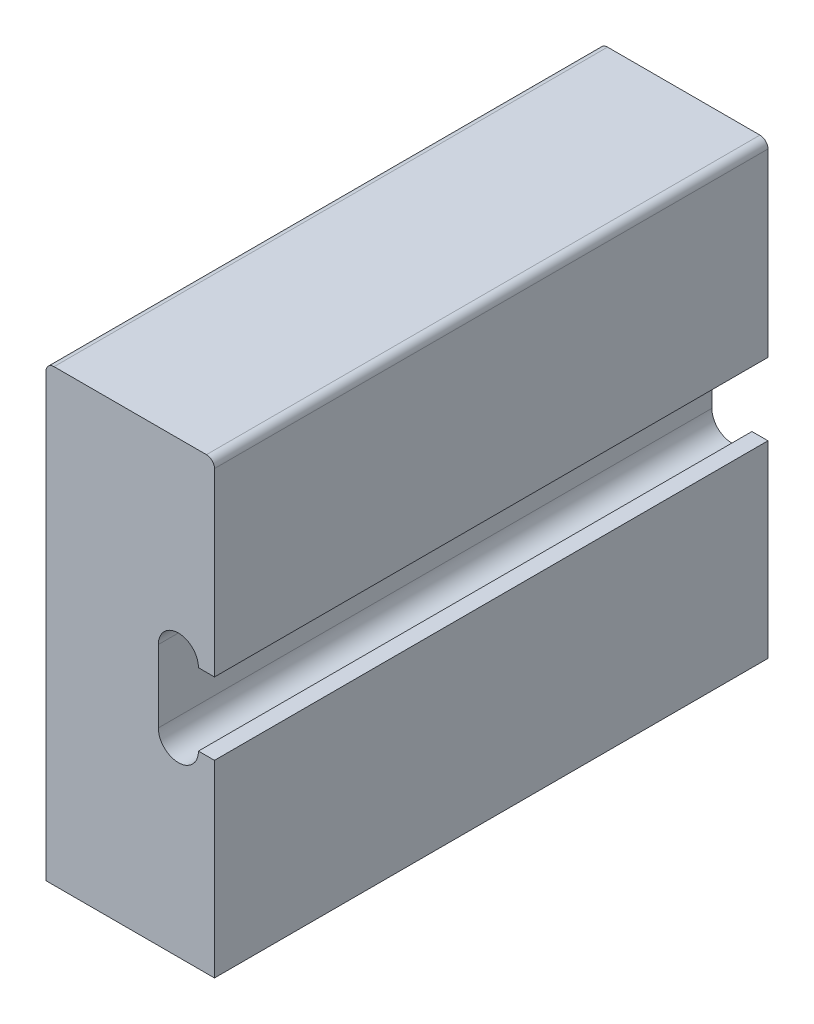
ISO-10303-21;
HEADER;
FILE_DESCRIPTION(('STEP AP214'),'2;1');
FILE_NAME('part.step','',(''),(''),'','','');
FILE_SCHEMA(('AUTOMOTIVE_DESIGN { 1 0 10303 214 1 1 1 1 }'));
ENDSEC;
DATA;
#1=APPLICATION_CONTEXT('core data for automotive mechanical design processes');
#2=APPLICATION_PROTOCOL_DEFINITION('international standard','automotive_design',2000,#1);
#3=PRODUCT_CONTEXT('',#1,'mechanical');
#4=PRODUCT('Part','Part','',(#3));
#5=PRODUCT_RELATED_PRODUCT_CATEGORY('part','',(#4));
#6=PRODUCT_DEFINITION_FORMATION('','',#4);
#7=PRODUCT_DEFINITION_CONTEXT('part definition',#1,'design');
#8=PRODUCT_DEFINITION('design','',#6,#7);
#9=PRODUCT_DEFINITION_SHAPE('','',#8);
#10=(LENGTH_UNIT() NAMED_UNIT(*) SI_UNIT(.MILLI.,.METRE.));
#11=(NAMED_UNIT(*) PLANE_ANGLE_UNIT() SI_UNIT($,.RADIAN.));
#12=(NAMED_UNIT(*) SI_UNIT($,.STERADIAN.) SOLID_ANGLE_UNIT());
#13=UNCERTAINTY_MEASURE_WITH_UNIT(LENGTH_MEASURE(1.E-05),#10,'distance_accuracy_value','');
#14=(GEOMETRIC_REPRESENTATION_CONTEXT(3) GLOBAL_UNCERTAINTY_ASSIGNED_CONTEXT((#13)) GLOBAL_UNIT_ASSIGNED_CONTEXT((#10,
#11,#12)) REPRESENTATION_CONTEXT('',''));
#15=CARTESIAN_POINT('',(0.,0.,0.));
#16=DIRECTION('',(0.,0.,1.));
#17=DIRECTION('',(1.,0.,0.));
#18=AXIS2_PLACEMENT_3D('',#15,#16,#17);
#19=CARTESIAN_POINT('',(21.,0.,0.));
#20=DIRECTION('',(-1.,0.,0.));
#21=DIRECTION('',(0.,0.,1.));
#22=AXIS2_PLACEMENT_3D('',#19,#20,#21);
#23=PLANE('',#22);
#24=DIRECTION('',(0.,-1.,0.));
#25=VECTOR('',#24,1.);
#26=CARTESIAN_POINT('',(21.,-28.,34.5));
#27=LINE('',#26,#25);
#28=CARTESIAN_POINT('',(21.,27.,34.5));
#29=VERTEX_POINT('',#28);
#30=CARTESIAN_POINT('',(21.,4.49999999999999,34.5));
#31=VERTEX_POINT('',#30);
#32=EDGE_CURVE('E172',#29,#31,#27,.T.);
#33=ORIENTED_EDGE('',*,*,#32,.T.);
#34=DIRECTION('',(0.,0.,-1.));
#35=VECTOR('',#34,1.);
#36=CARTESIAN_POINT('',(21.,4.49999999999999,34.5));
#37=LINE('',#36,#35);
#38=CARTESIAN_POINT('',(21.,4.5,-34.5));
#39=VERTEX_POINT('',#38);
#40=EDGE_CURVE('E163',#31,#39,#37,.T.);
#41=ORIENTED_EDGE('',*,*,#40,.T.);
#42=DIRECTION('',(0.,1.,0.));
#43=VECTOR('',#42,1.);
#44=CARTESIAN_POINT('',(21.,28.,-34.5));
#45=LINE('',#44,#43);
#46=CARTESIAN_POINT('',(21.,27.,-34.5));
#47=VERTEX_POINT('',#46);
#48=EDGE_CURVE('E54',#39,#47,#45,.T.);
#49=ORIENTED_EDGE('',*,*,#48,.T.);
#50=DIRECTION('',(0.,0.,1.));
#51=VECTOR('',#50,1.);
#52=CARTESIAN_POINT('',(21.,27.,0.));
#53=LINE('',#52,#51);
#54=EDGE_CURVE('E11',#47,#29,#53,.T.);
#55=ORIENTED_EDGE('',*,*,#54,.T.);
#56=EDGE_LOOP('',(#33,#41,#49,#55));
#57=FACE_BOUND('',#56,.T.);
#58=ADVANCED_FACE('F32',(#57),#23,.F.);
#59=CARTESIAN_POINT('',(21.,-28.,-34.5));
#60=DIRECTION('',(0.,1.,0.));
#61=DIRECTION('',(0.,0.,1.));
#62=AXIS2_PLACEMENT_3D('',#59,#60,#61);
#63=PLANE('',#62);
#64=DIRECTION('',(0.,0.,-1.));
#65=VECTOR('',#64,1.);
#66=CARTESIAN_POINT('',(0.,-28.,-34.5));
#67=LINE('',#66,#65);
#68=CARTESIAN_POINT('',(0.,-28.,34.5));
#69=VERTEX_POINT('',#68);
#70=CARTESIAN_POINT('',(0.,-28.,-34.5));
#71=VERTEX_POINT('',#70);
#72=EDGE_CURVE('E165',#69,#71,#67,.T.);
#73=ORIENTED_EDGE('',*,*,#72,.T.);
#74=DIRECTION('',(-1.,0.,0.));
#75=VECTOR('',#74,1.);
#76=CARTESIAN_POINT('',(21.,-28.,-34.5));
#77=LINE('',#76,#75);
#78=CARTESIAN_POINT('',(21.,-28.,-34.5));
#79=VERTEX_POINT('',#78);
#80=EDGE_CURVE('E192',#79,#71,#77,.T.);
#81=ORIENTED_EDGE('',*,*,#80,.F.);
#82=DIRECTION('',(0.,0.,-1.));
#83=VECTOR('',#82,1.);
#84=CARTESIAN_POINT('',(21.,-28.,-34.5));
#85=LINE('',#84,#83);
#86=CARTESIAN_POINT('',(21.,-28.,34.5));
#87=VERTEX_POINT('',#86);
#88=EDGE_CURVE('E175',#87,#79,#85,.T.);
#89=ORIENTED_EDGE('',*,*,#88,.F.);
#90=DIRECTION('',(-1.,0.,0.));
#91=VECTOR('',#90,1.);
#92=CARTESIAN_POINT('',(21.,-28.,34.5));
#93=LINE('',#92,#91);
#94=EDGE_CURVE('E195',#87,#69,#93,.T.);
#95=ORIENTED_EDGE('',*,*,#94,.T.);
#96=EDGE_LOOP('',(#73,#81,#89,#95));
#97=FACE_BOUND('',#96,.T.);
#98=ADVANCED_FACE('F231',(#97),#63,.F.);
#99=CARTESIAN_POINT('',(21.,28.,-34.5));
#100=DIRECTION('',(0.,0.,1.));
#101=DIRECTION('',(0.,-1.,0.));
#102=AXIS2_PLACEMENT_3D('',#99,#100,#101);
#103=PLANE('',#102);
#104=ORIENTED_EDGE('',*,*,#48,.F.);
#105=DIRECTION('',(1.,0.,0.));
#106=VECTOR('',#105,1.);
#107=CARTESIAN_POINT('',(19.,4.5,-34.5));
#108=LINE('',#107,#106);
#109=CARTESIAN_POINT('',(19.,4.5,-34.5));
#110=VERTEX_POINT('',#109);
#111=EDGE_CURVE('E144',#110,#39,#108,.T.);
#112=ORIENTED_EDGE('',*,*,#111,.F.);
#113=CARTESIAN_POINT('',(16.5,4.5,-34.5));
#114=DIRECTION('',(0.,0.,-1.));
#115=DIRECTION('',(0.,1.,0.));
#116=AXIS2_PLACEMENT_3D('',#113,#114,#115);
#117=CIRCLE('',#116,2.5);
#118=CARTESIAN_POINT('',(14.,4.5,-34.5));
#119=VERTEX_POINT('',#118);
#120=EDGE_CURVE('E146',#119,#110,#117,.T.);
#121=ORIENTED_EDGE('',*,*,#120,.F.);
#122=DIRECTION('',(0.,1.,0.));
#123=VECTOR('',#122,1.);
#124=CARTESIAN_POINT('',(14.,-4.5,-34.5));
#125=LINE('',#124,#123);
#126=CARTESIAN_POINT('',(14.,-4.5,-34.5));
#127=VERTEX_POINT('',#126);
#128=EDGE_CURVE('E158',#127,#119,#125,.T.);
#129=ORIENTED_EDGE('',*,*,#128,.F.);
#130=CARTESIAN_POINT('',(16.5,-4.5,-34.5));
#131=DIRECTION('',(0.,0.,-1.));
#132=DIRECTION('',(0.,1.,0.));
#133=AXIS2_PLACEMENT_3D('',#130,#131,#132);
#134=CIRCLE('',#133,2.5);
#135=CARTESIAN_POINT('',(19.,-4.5,-34.5));
#136=VERTEX_POINT('',#135);
#137=EDGE_CURVE('E156',#136,#127,#134,.T.);
#138=ORIENTED_EDGE('',*,*,#137,.F.);
#139=DIRECTION('',(-1.,0.,0.));
#140=VECTOR('',#139,1.);
#141=CARTESIAN_POINT('',(21.,-4.5,-34.5));
#142=LINE('',#141,#140);
#143=CARTESIAN_POINT('',(21.,-4.5,-34.5));
#144=VERTEX_POINT('',#143);
#145=EDGE_CURVE('E124',#144,#136,#142,.T.);
#146=ORIENTED_EDGE('',*,*,#145,.F.);
#147=EDGE_CURVE('E177',#79,#144,#45,.T.);
#148=ORIENTED_EDGE('',*,*,#147,.F.);
#149=ORIENTED_EDGE('',*,*,#80,.T.);
#150=DIRECTION('',(0.,1.,0.));
#151=VECTOR('',#150,1.);
#152=CARTESIAN_POINT('',(0.,28.,-34.5));
#153=LINE('',#152,#151);
#154=CARTESIAN_POINT('',(0.,27.,-34.5));
#155=VERTEX_POINT('',#154);
#156=EDGE_CURVE('E182',#71,#155,#153,.T.);
#157=ORIENTED_EDGE('',*,*,#156,.T.);
#158=CARTESIAN_POINT('',(1.,27.,-34.5));
#159=DIRECTION('',(0.,0.,1.));
#160=DIRECTION('',(0.,-1.,0.));
#161=AXIS2_PLACEMENT_3D('',#158,#159,#160);
#162=CIRCLE('',#161,1.);
#163=CARTESIAN_POINT('',(1.00000000000001,28.,-34.5));
#164=VERTEX_POINT('',#163);
#165=EDGE_CURVE('E40',#155,#164,#162,.F.);
#166=ORIENTED_EDGE('',*,*,#165,.T.);
#167=DIRECTION('',(-1.,0.,0.));
#168=VECTOR('',#167,1.);
#169=CARTESIAN_POINT('',(21.,28.,-34.5));
#170=LINE('',#169,#168);
#171=CARTESIAN_POINT('',(20.,28.,-34.5));
#172=VERTEX_POINT('',#171);
#173=EDGE_CURVE('E189',#172,#164,#170,.T.);
#174=ORIENTED_EDGE('',*,*,#173,.F.);
#175=CARTESIAN_POINT('',(20.,27.,-34.5));
#176=DIRECTION('',(0.,0.,1.));
#177=DIRECTION('',(0.,-1.,0.));
#178=AXIS2_PLACEMENT_3D('',#175,#176,#177);
#179=CIRCLE('',#178,1.);
#180=EDGE_CURVE('E209',#172,#47,#179,.F.);
#181=ORIENTED_EDGE('',*,*,#180,.T.);
#182=EDGE_LOOP('',(#104,#112,#121,#129,#138,#146,#148,#149,#157,#166,#174,#181));
#183=FACE_BOUND('',#182,.T.);
#184=ADVANCED_FACE('F213',(#183),#103,.F.);
#185=CARTESIAN_POINT('',(21.,28.,34.5));
#186=DIRECTION('',(0.,-1.,0.));
#187=DIRECTION('',(0.,0.,-1.));
#188=AXIS2_PLACEMENT_3D('',#185,#186,#187);
#189=PLANE('',#188);
#190=ORIENTED_EDGE('',*,*,#173,.T.);
#191=DIRECTION('',(0.,0.,1.));
#192=VECTOR('',#191,1.);
#193=CARTESIAN_POINT('',(1.,28.,34.5));
#194=LINE('',#193,#192);
#195=CARTESIAN_POINT('',(1.00000000000001,28.,34.5));
#196=VERTEX_POINT('',#195);
#197=EDGE_CURVE('E200',#164,#196,#194,.T.);
#198=ORIENTED_EDGE('',*,*,#197,.T.);
#199=DIRECTION('',(-1.,0.,0.));
#200=VECTOR('',#199,1.);
#201=CARTESIAN_POINT('',(21.,28.,34.5));
#202=LINE('',#201,#200);
#203=CARTESIAN_POINT('',(20.,28.,34.5));
#204=VERTEX_POINT('',#203);
#205=EDGE_CURVE('E180',#204,#196,#202,.T.);
#206=ORIENTED_EDGE('',*,*,#205,.F.);
#207=DIRECTION('',(0.,0.,1.));
#208=VECTOR('',#207,1.);
#209=CARTESIAN_POINT('',(20.,28.,34.5));
#210=LINE('',#209,#208);
#211=EDGE_CURVE('E198',#204,#172,#210,.F.);
#212=ORIENTED_EDGE('',*,*,#211,.T.);
#213=EDGE_LOOP('',(#190,#198,#206,#212));
#214=FACE_BOUND('',#213,.T.);
#215=ADVANCED_FACE('F220',(#214),#189,.F.);
#216=CARTESIAN_POINT('',(21.,0.,34.5));
#217=DIRECTION('',(0.,0.,-1.));
#218=DIRECTION('',(-1.,0.,0.));
#219=AXIS2_PLACEMENT_3D('',#216,#217,#218);
#220=PLANE('',#219);
#221=CARTESIAN_POINT('',(16.5,4.49999999999999,34.5));
#222=DIRECTION('',(0.,0.,-1.));
#223=DIRECTION('',(0.,1.,0.));
#224=AXIS2_PLACEMENT_3D('',#221,#222,#223);
#225=CIRCLE('',#224,2.5);
#226=CARTESIAN_POINT('',(14.,4.49999999999999,34.5));
#227=VERTEX_POINT('',#226);
#228=CARTESIAN_POINT('',(19.,4.49999999999999,34.5));
#229=VERTEX_POINT('',#228);
#230=EDGE_CURVE('E150',#227,#229,#225,.T.);
#231=ORIENTED_EDGE('',*,*,#230,.T.);
#232=DIRECTION('',(1.,0.,0.));
#233=VECTOR('',#232,1.);
#234=CARTESIAN_POINT('',(19.,4.49999999999999,34.5));
#235=LINE('',#234,#233);
#236=EDGE_CURVE('E152',#229,#31,#235,.T.);
#237=ORIENTED_EDGE('',*,*,#236,.T.);
#238=ORIENTED_EDGE('',*,*,#32,.F.);
#239=CARTESIAN_POINT('',(20.,27.,34.5));
#240=DIRECTION('',(0.,0.,-1.));
#241=DIRECTION('',(-1.,0.,0.));
#242=AXIS2_PLACEMENT_3D('',#239,#240,#241);
#243=CIRCLE('',#242,1.);
#244=EDGE_CURVE('E203',#29,#204,#243,.F.);
#245=ORIENTED_EDGE('',*,*,#244,.T.);
#246=ORIENTED_EDGE('',*,*,#205,.T.);
#247=CARTESIAN_POINT('',(1.,27.,34.5));
#248=DIRECTION('',(0.,0.,-1.));
#249=DIRECTION('',(-1.,0.,0.));
#250=AXIS2_PLACEMENT_3D('',#247,#248,#249);
#251=CIRCLE('',#250,1.);
#252=CARTESIAN_POINT('',(0.,27.,34.5));
#253=VERTEX_POINT('',#252);
#254=EDGE_CURVE('E205',#196,#253,#251,.F.);
#255=ORIENTED_EDGE('',*,*,#254,.T.);
#256=DIRECTION('',(0.,-1.,0.));
#257=VECTOR('',#256,1.);
#258=CARTESIAN_POINT('',(0.,0.,34.5));
#259=LINE('',#258,#257);
#260=EDGE_CURVE('E185',#253,#69,#259,.T.);
#261=ORIENTED_EDGE('',*,*,#260,.T.);
#262=ORIENTED_EDGE('',*,*,#94,.F.);
#263=CARTESIAN_POINT('',(21.,-4.50000000000001,34.5));
#264=VERTEX_POINT('',#263);
#265=EDGE_CURVE('E143',#264,#87,#27,.T.);
#266=ORIENTED_EDGE('',*,*,#265,.F.);
#267=DIRECTION('',(-1.,0.,0.));
#268=VECTOR('',#267,1.);
#269=CARTESIAN_POINT('',(21.,-4.50000000000001,34.5));
#270=LINE('',#269,#268);
#271=CARTESIAN_POINT('',(19.,-4.50000000000001,34.5));
#272=VERTEX_POINT('',#271);
#273=EDGE_CURVE('E47',#264,#272,#270,.T.);
#274=ORIENTED_EDGE('',*,*,#273,.T.);
#275=CARTESIAN_POINT('',(16.5,-4.50000000000001,34.5));
#276=DIRECTION('',(0.,0.,-1.));
#277=DIRECTION('',(0.,1.,0.));
#278=AXIS2_PLACEMENT_3D('',#275,#276,#277);
#279=CIRCLE('',#278,2.5);
#280=CARTESIAN_POINT('',(14.,-4.50000000000001,34.5));
#281=VERTEX_POINT('',#280);
#282=EDGE_CURVE('E132',#272,#281,#279,.T.);
#283=ORIENTED_EDGE('',*,*,#282,.T.);
#284=DIRECTION('',(0.,1.,0.));
#285=VECTOR('',#284,1.);
#286=CARTESIAN_POINT('',(14.,-4.50000000000001,34.5));
#287=LINE('',#286,#285);
#288=EDGE_CURVE('E137',#281,#227,#287,.T.);
#289=ORIENTED_EDGE('',*,*,#288,.T.);
#290=EDGE_LOOP('',(#231,#237,#238,#245,#246,#255,#261,#262,#266,#274,#283,#289));
#291=FACE_BOUND('',#290,.T.);
#292=ADVANCED_FACE('F141',(#291),#220,.F.);
#293=ORIENTED_EDGE('',*,*,#147,.T.);
#294=DIRECTION('',(0.,0.,-1.));
#295=VECTOR('',#294,1.);
#296=CARTESIAN_POINT('',(21.,-4.50000000000001,34.5));
#297=LINE('',#296,#295);
#298=EDGE_CURVE('E129',#264,#144,#297,.T.);
#299=ORIENTED_EDGE('',*,*,#298,.F.);
#300=ORIENTED_EDGE('',*,*,#265,.T.);
#301=ORIENTED_EDGE('',*,*,#88,.T.);
#302=EDGE_LOOP('',(#293,#299,#300,#301));
#303=FACE_BOUND('',#302,.T.);
#304=ADVANCED_FACE('F234',(#303),#23,.F.);
#305=CARTESIAN_POINT('',(0.,0.,0.));
#306=DIRECTION('',(-1.,0.,0.));
#307=DIRECTION('',(0.,0.,1.));
#308=AXIS2_PLACEMENT_3D('',#305,#306,#307);
#309=PLANE('',#308);
#310=ORIENTED_EDGE('',*,*,#260,.F.);
#311=DIRECTION('',(0.,0.,1.));
#312=VECTOR('',#311,1.);
#313=CARTESIAN_POINT('',(0.,27.,-34.5));
#314=LINE('',#313,#312);
#315=EDGE_CURVE('E207',#253,#155,#314,.F.);
#316=ORIENTED_EDGE('',*,*,#315,.T.);
#317=ORIENTED_EDGE('',*,*,#156,.F.);
#318=ORIENTED_EDGE('',*,*,#72,.F.);
#319=EDGE_LOOP('',(#310,#316,#317,#318));
#320=FACE_BOUND('',#319,.T.);
#321=ADVANCED_FACE('F227',(#320),#309,.T.);
#322=CARTESIAN_POINT('',(1.,27.,34.5));
#323=DIRECTION('',(0.,0.,-1.));
#324=DIRECTION('',(-1.,0.,0.));
#325=AXIS2_PLACEMENT_3D('',#322,#323,#324);
#326=CYLINDRICAL_SURFACE('',#325,1.);
#327=ORIENTED_EDGE('',*,*,#165,.F.);
#328=ORIENTED_EDGE('',*,*,#315,.F.);
#329=ORIENTED_EDGE('',*,*,#254,.F.);
#330=ORIENTED_EDGE('',*,*,#197,.F.);
#331=EDGE_LOOP('',(#327,#328,#329,#330));
#332=FACE_BOUND('',#331,.T.);
#333=ADVANCED_FACE('F223',(#332),#326,.T.);
#334=CARTESIAN_POINT('',(20.,27.,0.));
#335=DIRECTION('',(0.,0.,1.));
#336=DIRECTION('',(1.,0.,0.));
#337=AXIS2_PLACEMENT_3D('',#334,#335,#336);
#338=CYLINDRICAL_SURFACE('',#337,1.);
#339=ORIENTED_EDGE('',*,*,#180,.F.);
#340=ORIENTED_EDGE('',*,*,#211,.F.);
#341=ORIENTED_EDGE('',*,*,#244,.F.);
#342=ORIENTED_EDGE('',*,*,#54,.F.);
#343=EDGE_LOOP('',(#339,#340,#341,#342));
#344=FACE_BOUND('',#343,.T.);
#345=ADVANCED_FACE('F34',(#344),#338,.T.);
#346=CARTESIAN_POINT('',(19.,4.49999999999999,34.5));
#347=DIRECTION('',(0.,1.,0.));
#348=DIRECTION('',(-1.,0.,0.));
#349=AXIS2_PLACEMENT_3D('',#346,#347,#348);
#350=PLANE('',#349);
#351=ORIENTED_EDGE('',*,*,#111,.T.);
#352=ORIENTED_EDGE('',*,*,#40,.F.);
#353=ORIENTED_EDGE('',*,*,#236,.F.);
#354=DIRECTION('',(0.,0.,-1.));
#355=VECTOR('',#354,1.);
#356=CARTESIAN_POINT('',(19.,4.49999999999999,34.5));
#357=LINE('',#356,#355);
#358=EDGE_CURVE('E166',#229,#110,#357,.T.);
#359=ORIENTED_EDGE('',*,*,#358,.T.);
#360=EDGE_LOOP('',(#351,#352,#353,#359));
#361=FACE_BOUND('',#360,.T.);
#362=ADVANCED_FACE('F246',(#361),#350,.F.);
#363=CARTESIAN_POINT('',(16.5,4.49999999999999,34.5));
#364=DIRECTION('',(0.,0.,-1.));
#365=DIRECTION('',(0.,1.,0.));
#366=AXIS2_PLACEMENT_3D('',#363,#364,#365);
#367=CYLINDRICAL_SURFACE('',#366,2.5);
#368=ORIENTED_EDGE('',*,*,#120,.T.);
#369=ORIENTED_EDGE('',*,*,#358,.F.);
#370=ORIENTED_EDGE('',*,*,#230,.F.);
#371=DIRECTION('',(0.,0.,-1.));
#372=VECTOR('',#371,1.);
#373=CARTESIAN_POINT('',(14.,4.49999999999999,34.5));
#374=LINE('',#373,#372);
#375=EDGE_CURVE('E168',#227,#119,#374,.T.);
#376=ORIENTED_EDGE('',*,*,#375,.T.);
#377=EDGE_LOOP('',(#368,#369,#370,#376));
#378=FACE_BOUND('',#377,.T.);
#379=ADVANCED_FACE('F244',(#378),#367,.F.);
#380=CARTESIAN_POINT('',(14.,-4.50000000000001,34.5));
#381=DIRECTION('',(-1.,0.,0.));
#382=DIRECTION('',(0.,0.,1.));
#383=AXIS2_PLACEMENT_3D('',#380,#381,#382);
#384=PLANE('',#383);
#385=ORIENTED_EDGE('',*,*,#128,.T.);
#386=ORIENTED_EDGE('',*,*,#375,.F.);
#387=ORIENTED_EDGE('',*,*,#288,.F.);
#388=DIRECTION('',(0.,0.,-1.));
#389=VECTOR('',#388,1.);
#390=CARTESIAN_POINT('',(14.,-4.50000000000001,34.5));
#391=LINE('',#390,#389);
#392=EDGE_CURVE('E128',#281,#127,#391,.T.);
#393=ORIENTED_EDGE('',*,*,#392,.T.);
#394=EDGE_LOOP('',(#385,#386,#387,#393));
#395=FACE_BOUND('',#394,.T.);
#396=ADVANCED_FACE('F239',(#395),#384,.F.);
#397=CARTESIAN_POINT('',(16.5,-4.50000000000001,34.5));
#398=DIRECTION('',(0.,0.,-1.));
#399=DIRECTION('',(0.,1.,0.));
#400=AXIS2_PLACEMENT_3D('',#397,#398,#399);
#401=CYLINDRICAL_SURFACE('',#400,2.5);
#402=ORIENTED_EDGE('',*,*,#137,.T.);
#403=ORIENTED_EDGE('',*,*,#392,.F.);
#404=ORIENTED_EDGE('',*,*,#282,.F.);
#405=DIRECTION('',(0.,0.,-1.));
#406=VECTOR('',#405,1.);
#407=CARTESIAN_POINT('',(19.,-4.50000000000001,34.5));
#408=LINE('',#407,#406);
#409=EDGE_CURVE('E120',#272,#136,#408,.T.);
#410=ORIENTED_EDGE('',*,*,#409,.T.);
#411=EDGE_LOOP('',(#402,#403,#404,#410));
#412=FACE_BOUND('',#411,.T.);
#413=ADVANCED_FACE('F133',(#412),#401,.F.);
#414=CARTESIAN_POINT('',(21.,-4.50000000000001,34.5));
#415=DIRECTION('',(0.,-1.,0.));
#416=DIRECTION('',(0.,0.,-1.));
#417=AXIS2_PLACEMENT_3D('',#414,#415,#416);
#418=PLANE('',#417);
#419=ORIENTED_EDGE('',*,*,#145,.T.);
#420=ORIENTED_EDGE('',*,*,#409,.F.);
#421=ORIENTED_EDGE('',*,*,#273,.F.);
#422=ORIENTED_EDGE('',*,*,#298,.T.);
#423=EDGE_LOOP('',(#419,#420,#421,#422));
#424=FACE_BOUND('',#423,.T.);
#425=ADVANCED_FACE('F122',(#424),#418,.F.);
#426=CLOSED_SHELL('',(#58,#98,#184,#215,#292,#304,#321,#333,#345,#362,#379,#396,#413,#425));
#427=MANIFOLD_SOLID_BREP('B2',#426);
#428=ADVANCED_BREP_SHAPE_REPRESENTATION('',(#18,#427),#14);
#429=SHAPE_DEFINITION_REPRESENTATION(#9,#428);
ENDSEC;
END-ISO-10303-21;
